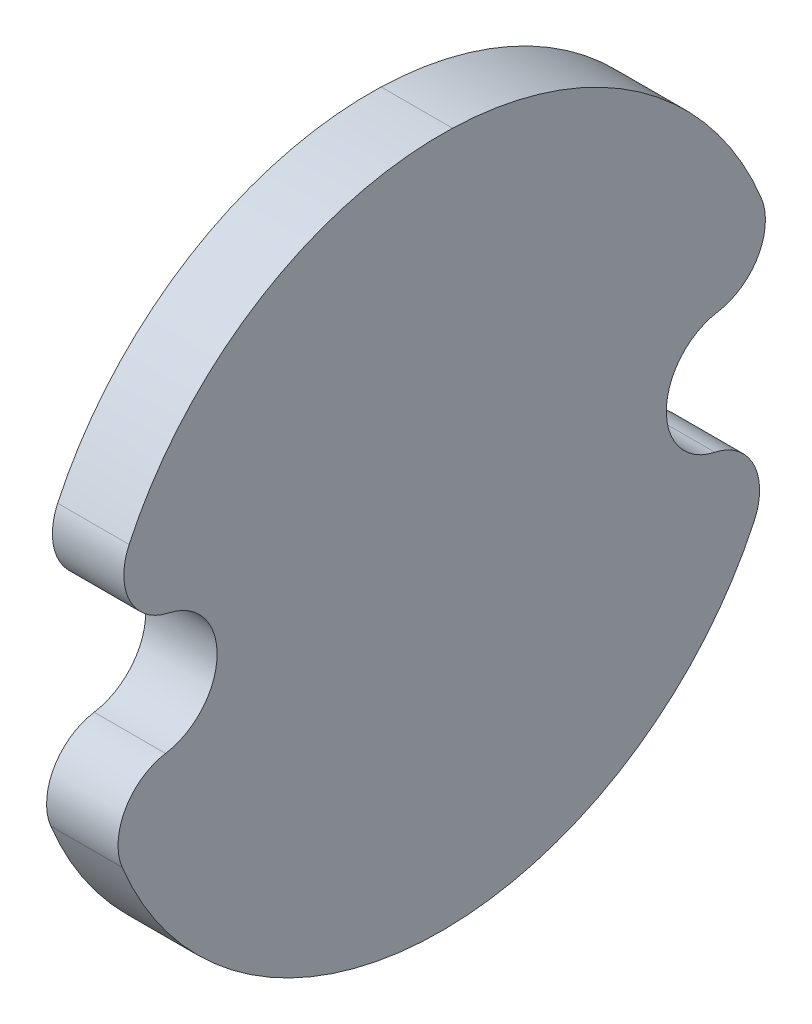
ISO-10303-21;
HEADER;
FILE_DESCRIPTION(('STEP AP214'),'2;1');
FILE_NAME('part.step','',(''),(''),'','','');
FILE_SCHEMA(('AUTOMOTIVE_DESIGN { 1 0 10303 214 1 1 1 1 }'));
ENDSEC;
DATA;
#1=APPLICATION_CONTEXT('core data for automotive mechanical design processes');
#2=APPLICATION_PROTOCOL_DEFINITION('international standard','automotive_design',2000,#1);
#3=PRODUCT_CONTEXT('',#1,'mechanical');
#4=PRODUCT('Part','Part','',(#3));
#5=PRODUCT_RELATED_PRODUCT_CATEGORY('part','',(#4));
#6=PRODUCT_DEFINITION_FORMATION('','',#4);
#7=PRODUCT_DEFINITION_CONTEXT('part definition',#1,'design');
#8=PRODUCT_DEFINITION('design','',#6,#7);
#9=PRODUCT_DEFINITION_SHAPE('','',#8);
#10=(LENGTH_UNIT() NAMED_UNIT(*) SI_UNIT(.MILLI.,.METRE.));
#11=(NAMED_UNIT(*) PLANE_ANGLE_UNIT() SI_UNIT($,.RADIAN.));
#12=(NAMED_UNIT(*) SI_UNIT($,.STERADIAN.) SOLID_ANGLE_UNIT());
#13=UNCERTAINTY_MEASURE_WITH_UNIT(LENGTH_MEASURE(1.E-05),#10,'distance_accuracy_value','');
#14=(GEOMETRIC_REPRESENTATION_CONTEXT(3) GLOBAL_UNCERTAINTY_ASSIGNED_CONTEXT((#13)) GLOBAL_UNIT_ASSIGNED_CONTEXT((#10,
#11,#12)) REPRESENTATION_CONTEXT('',''));
#15=CARTESIAN_POINT('',(0.,0.,0.));
#16=DIRECTION('',(0.,0.,1.));
#17=DIRECTION('',(1.,0.,0.));
#18=AXIS2_PLACEMENT_3D('',#15,#16,#17);
#19=CARTESIAN_POINT('',(-8.8260577609674,14.645610965575,4.562544302552));
#20=DIRECTION('',(1.,0.,0.));
#21=DIRECTION('',(0.,0.999511118958298,-0.031265365482126));
#22=AXIS2_PLACEMENT_3D('',#19,#20,#21);
#23=CYLINDRICAL_SURFACE('',#22,18.35);
#24=CARTESIAN_POINT('',(-8.8260577609674,14.645610965575,4.562544302552));
#25=DIRECTION('',(1.,0.,0.));
#26=DIRECTION('',(0.,0.999511118958298,-0.031265365482126));
#27=AXIS2_PLACEMENT_3D('',#24,#25,#26);
#28=CIRCLE('',#27,18.35);
#29=CARTESIAN_POINT('',(-8.8260577609674,21.5696866041654,-12.4309743604877));
#30=VERTEX_POINT('',#29);
#31=CARTESIAN_POINT('',(-8.8260577609674,32.9866399984598,3.98882484595499));
#32=VERTEX_POINT('',#31);
#33=EDGE_CURVE('E10',#30,#32,#28,.T.);
#34=ORIENTED_EDGE('',*,*,#33,.T.);
#35=DIRECTION('',(1.,0.,0.));
#36=VECTOR('',#35,1.);
#37=CARTESIAN_POINT('',(-8.8260577609674,32.9866399984598,3.98882484595499));
#38=LINE('',#37,#36);
#39=CARTESIAN_POINT('',(-5.0260577609674,32.9866399984598,3.98882484595499));
#40=VERTEX_POINT('',#39);
#41=EDGE_CURVE('E26',#32,#40,#38,.T.);
#42=ORIENTED_EDGE('',*,*,#41,.T.);
#43=CARTESIAN_POINT('',(-5.0260577609674,14.645610965575,4.562544302552));
#44=DIRECTION('',(1.,0.,0.));
#45=DIRECTION('',(0.,0.999511118958298,-0.031265365482126));
#46=AXIS2_PLACEMENT_3D('',#43,#44,#45);
#47=CIRCLE('',#46,18.35);
#48=CARTESIAN_POINT('',(-5.0260577609674,21.5696866041654,-12.4309743604877));
#49=VERTEX_POINT('',#48);
#50=EDGE_CURVE('E52',#49,#40,#47,.T.);
#51=ORIENTED_EDGE('',*,*,#50,.F.);
#52=DIRECTION('',(-1.,0.,0.));
#53=VECTOR('',#52,1.);
#54=CARTESIAN_POINT('',(-8.8260577609674,21.5696866041654,-12.4309743604877));
#55=LINE('',#54,#53);
#56=EDGE_CURVE('E235',#49,#30,#55,.T.);
#57=ORIENTED_EDGE('',*,*,#56,.T.);
#58=EDGE_LOOP('',(#34,#42,#51,#57));
#59=FACE_BOUND('',#58,.T.);
#60=ADVANCED_FACE('F16',(#59),#23,.T.);
#61=CARTESIAN_POINT('',(-5.0260577609674,14.645610965575,4.562544302552));
#62=DIRECTION('',(1.,0.,0.));
#63=DIRECTION('',(0.,0.999511118958298,-0.031265365482126));
#64=AXIS2_PLACEMENT_3D('',#61,#62,#63);
#65=PLANE('',#64);
#66=ORIENTED_EDGE('',*,*,#50,.T.);
#67=CARTESIAN_POINT('',(-5.0260577609674,14.645610965575,4.562544302552));
#68=DIRECTION('',(1.,0.,0.));
#69=DIRECTION('',(0.,0.999511118958298,-0.031265365482126));
#70=AXIS2_PLACEMENT_3D('',#67,#68,#69);
#71=CIRCLE('',#70,18.35);
#72=CARTESIAN_POINT('',(-5.0260577609674,22.4118076128462,21.1880875909957));
#73=VERTEX_POINT('',#72);
#74=EDGE_CURVE('E241',#40,#73,#71,.T.);
#75=ORIENTED_EDGE('',*,*,#74,.T.);
#76=CARTESIAN_POINT('',(-5.0260577609674,21.1421296868618,18.4700151187706));
#77=DIRECTION('',(1.,0.,0.));
#78=DIRECTION('',(0.,0.999511118958298,-0.031265365482126));
#79=AXIS2_PLACEMENT_3D('',#76,#77,#78);
#80=CIRCLE('',#79,3.);
#81=CARTESIAN_POINT('',(-5.0260577609674,18.2065002726354,19.088141272827));
#82=VERTEX_POINT('',#81);
#83=EDGE_CURVE('E248',#73,#82,#80,.T.);
#84=ORIENTED_EDGE('',*,*,#83,.T.);
#85=CARTESIAN_POINT('',(-5.0260577609674,15.0262350738901,19.7577779397216));
#86=DIRECTION('',(-1.,0.,0.));
#87=DIRECTION('',(0.,0.999511118958298,-0.031265365482126));
#88=AXIS2_PLACEMENT_3D('',#85,#86,#87);
#89=CIRCLE('',#88,3.25);
#90=CARTESIAN_POINT('',(-5.0260577609674,11.816431968235,19.2482055474878));
#91=VERTEX_POINT('',#90);
#92=EDGE_CURVE('E282',#82,#91,#89,.T.);
#93=ORIENTED_EDGE('',*,*,#92,.T.);
#94=CARTESIAN_POINT('',(-5.0260577609674,8.8535367937841,18.7778310315798));
#95=DIRECTION('',(1.,0.,0.));
#96=DIRECTION('',(0.,0.999511118958298,-0.031265365482126));
#97=AXIS2_PLACEMENT_3D('',#94,#95,#96);
#98=CIRCLE('',#97,3.);
#99=CARTESIAN_POINT('',(-5.0260577609674,7.72153532698459,21.5560629655917));
#100=VERTEX_POINT('',#99);
#101=EDGE_CURVE('E274',#91,#100,#98,.T.);
#102=ORIENTED_EDGE('',*,*,#101,.T.);
#103=CARTESIAN_POINT('',(-5.0260577609674,14.645610965575,4.562544302552));
#104=DIRECTION('',(1.,0.,0.));
#105=DIRECTION('',(0.,0.999511118958298,-0.031265365482126));
#106=AXIS2_PLACEMENT_3D('',#103,#104,#105);
#107=CIRCLE('',#106,18.35);
#108=CARTESIAN_POINT('',(-5.0260577609674,6.87941431830383,-12.0629989858917));
#109=VERTEX_POINT('',#108);
#110=EDGE_CURVE('E218',#100,#109,#107,.T.);
#111=ORIENTED_EDGE('',*,*,#110,.T.);
#112=CARTESIAN_POINT('',(-5.0260577609674,8.14909224428822,-9.34492651366656));
#113=DIRECTION('',(1.,0.,0.));
#114=DIRECTION('',(0.,0.999511118958298,-0.031265365482126));
#115=AXIS2_PLACEMENT_3D('',#112,#113,#114);
#116=CIRCLE('',#115,3.);
#117=CARTESIAN_POINT('',(-5.0260577609674,11.0847216585146,-9.96305266772303));
#118=VERTEX_POINT('',#117);
#119=EDGE_CURVE('E214',#109,#118,#116,.T.);
#120=ORIENTED_EDGE('',*,*,#119,.T.);
#121=CARTESIAN_POINT('',(-5.0260577609674,14.2649868572599,-10.6326893346176));
#122=DIRECTION('',(-1.,0.,0.));
#123=DIRECTION('',(0.,0.999511118958298,-0.031265365482126));
#124=AXIS2_PLACEMENT_3D('',#121,#122,#123);
#125=CIRCLE('',#124,3.25);
#126=CARTESIAN_POINT('',(-5.0260577609674,17.474789962915,-10.1231169423838));
#127=VERTEX_POINT('',#126);
#128=EDGE_CURVE('E219',#118,#127,#125,.T.);
#129=ORIENTED_EDGE('',*,*,#128,.T.);
#130=CARTESIAN_POINT('',(-5.0260577609674,20.4376851373659,-9.65274242647581));
#131=DIRECTION('',(1.,0.,0.));
#132=DIRECTION('',(0.,0.999511118958298,-0.031265365482126));
#133=AXIS2_PLACEMENT_3D('',#130,#131,#132);
#134=CIRCLE('',#133,3.);
#135=EDGE_CURVE('E236',#127,#49,#134,.T.);
#136=ORIENTED_EDGE('',*,*,#135,.T.);
#137=EDGE_LOOP('',(#66,#75,#84,#93,#102,#111,#120,#129,#136));
#138=FACE_BOUND('',#137,.T.);
#139=ADVANCED_FACE('F18',(#138),#65,.T.);
#140=CARTESIAN_POINT('',(-8.8260577609674,14.645610965575,4.562544302552));
#141=DIRECTION('',(1.,0.,0.));
#142=DIRECTION('',(0.,0.999511118958298,-0.031265365482126));
#143=AXIS2_PLACEMENT_3D('',#140,#141,#142);
#144=CYLINDRICAL_SURFACE('',#143,18.35);
#145=ORIENTED_EDGE('',*,*,#41,.F.);
#146=CARTESIAN_POINT('',(-8.8260577609674,14.645610965575,4.562544302552));
#147=DIRECTION('',(1.,0.,0.));
#148=DIRECTION('',(0.,0.999511118958298,-0.031265365482126));
#149=AXIS2_PLACEMENT_3D('',#146,#147,#148);
#150=CIRCLE('',#149,18.35);
#151=CARTESIAN_POINT('',(-8.8260577609674,22.4118076128462,21.1880875909957));
#152=VERTEX_POINT('',#151);
#153=EDGE_CURVE('E224',#32,#152,#150,.T.);
#154=ORIENTED_EDGE('',*,*,#153,.T.);
#155=DIRECTION('',(1.,0.,0.));
#156=VECTOR('',#155,1.);
#157=CARTESIAN_POINT('',(-8.8260577609674,22.4118076128462,21.1880875909957));
#158=LINE('',#157,#156);
#159=EDGE_CURVE('E220',#152,#73,#158,.T.);
#160=ORIENTED_EDGE('',*,*,#159,.T.);
#161=ORIENTED_EDGE('',*,*,#74,.F.);
#162=EDGE_LOOP('',(#145,#154,#160,#161));
#163=FACE_BOUND('',#162,.T.);
#164=ADVANCED_FACE('F337',(#163),#144,.T.);
#165=CARTESIAN_POINT('',(-8.8260577609674,20.4376851373659,-9.65274242647581));
#166=DIRECTION('',(1.,0.,0.));
#167=DIRECTION('',(0.,0.999511118958298,-0.031265365482126));
#168=AXIS2_PLACEMENT_3D('',#165,#166,#167);
#169=CYLINDRICAL_SURFACE('',#168,3.);
#170=CARTESIAN_POINT('',(-8.8260577609674,20.4376851373659,-9.65274242647581));
#171=DIRECTION('',(1.,0.,0.));
#172=DIRECTION('',(0.,0.999511118958298,-0.031265365482126));
#173=AXIS2_PLACEMENT_3D('',#170,#171,#172);
#174=CIRCLE('',#173,3.);
#175=CARTESIAN_POINT('',(-8.8260577609674,17.474789962915,-10.1231169423838));
#176=VERTEX_POINT('',#175);
#177=EDGE_CURVE('E225',#176,#30,#174,.T.);
#178=ORIENTED_EDGE('',*,*,#177,.T.);
#179=ORIENTED_EDGE('',*,*,#56,.F.);
#180=ORIENTED_EDGE('',*,*,#135,.F.);
#181=DIRECTION('',(-1.,0.,0.));
#182=VECTOR('',#181,1.);
#183=CARTESIAN_POINT('',(-8.8260577609674,17.474789962915,-10.1231169423838));
#184=LINE('',#183,#182);
#185=EDGE_CURVE('E251',#127,#176,#184,.T.);
#186=ORIENTED_EDGE('',*,*,#185,.T.);
#187=EDGE_LOOP('',(#178,#179,#180,#186));
#188=FACE_BOUND('',#187,.T.);
#189=ADVANCED_FACE('F344',(#188),#169,.T.);
#190=CARTESIAN_POINT('',(-8.8260577609674,14.2649868572599,-10.6326893346176));
#191=DIRECTION('',(1.,0.,0.));
#192=DIRECTION('',(0.,0.999511118958298,-0.031265365482126));
#193=AXIS2_PLACEMENT_3D('',#190,#191,#192);
#194=CYLINDRICAL_SURFACE('',#193,3.25);
#195=ORIENTED_EDGE('',*,*,#128,.F.);
#196=DIRECTION('',(1.,0.,0.));
#197=VECTOR('',#196,1.);
#198=CARTESIAN_POINT('',(-8.8260577609674,11.0847216585146,-9.96305266772303));
#199=LINE('',#198,#197);
#200=CARTESIAN_POINT('',(-8.8260577609674,11.0847216585146,-9.96305266772303));
#201=VERTEX_POINT('',#200);
#202=EDGE_CURVE('E276',#201,#118,#199,.T.);
#203=ORIENTED_EDGE('',*,*,#202,.F.);
#204=CARTESIAN_POINT('',(-8.8260577609674,14.2649868572599,-10.6326893346176));
#205=DIRECTION('',(1.,0.,0.));
#206=DIRECTION('',(0.,0.999511118958298,-0.031265365482126));
#207=AXIS2_PLACEMENT_3D('',#204,#205,#206);
#208=CIRCLE('',#207,3.25);
#209=EDGE_CURVE('E74',#176,#201,#208,.T.);
#210=ORIENTED_EDGE('',*,*,#209,.F.);
#211=ORIENTED_EDGE('',*,*,#185,.F.);
#212=EDGE_LOOP('',(#195,#203,#210,#211));
#213=FACE_BOUND('',#212,.T.);
#214=ADVANCED_FACE('F366',(#213),#194,.F.);
#215=CARTESIAN_POINT('',(-8.8260577609674,8.14909224428822,-9.34492651366656));
#216=DIRECTION('',(1.,0.,0.));
#217=DIRECTION('',(0.,0.999511118958298,-0.031265365482126));
#218=AXIS2_PLACEMENT_3D('',#215,#216,#217);
#219=CYLINDRICAL_SURFACE('',#218,3.);
#220=CARTESIAN_POINT('',(-8.8260577609674,8.14909224428822,-9.34492651366656));
#221=DIRECTION('',(1.,0.,0.));
#222=DIRECTION('',(0.,0.999511118958298,-0.031265365482126));
#223=AXIS2_PLACEMENT_3D('',#220,#221,#222);
#224=CIRCLE('',#223,3.);
#225=CARTESIAN_POINT('',(-8.8260577609674,6.87941431830383,-12.0629989858917));
#226=VERTEX_POINT('',#225);
#227=EDGE_CURVE('E279',#226,#201,#224,.T.);
#228=ORIENTED_EDGE('',*,*,#227,.T.);
#229=ORIENTED_EDGE('',*,*,#202,.T.);
#230=ORIENTED_EDGE('',*,*,#119,.F.);
#231=DIRECTION('',(-1.,0.,0.));
#232=VECTOR('',#231,1.);
#233=CARTESIAN_POINT('',(-8.8260577609674,6.87941431830382,-12.0629989858917));
#234=LINE('',#233,#232);
#235=EDGE_CURVE('E92',#109,#226,#234,.T.);
#236=ORIENTED_EDGE('',*,*,#235,.T.);
#237=EDGE_LOOP('',(#228,#229,#230,#236));
#238=FACE_BOUND('',#237,.T.);
#239=ADVANCED_FACE('F363',(#238),#219,.T.);
#240=CARTESIAN_POINT('',(-8.8260577609674,14.645610965575,4.562544302552));
#241=DIRECTION('',(1.,0.,0.));
#242=DIRECTION('',(0.,0.999511118958298,-0.031265365482126));
#243=AXIS2_PLACEMENT_3D('',#240,#241,#242);
#244=CYLINDRICAL_SURFACE('',#243,18.35);
#245=ORIENTED_EDGE('',*,*,#235,.F.);
#246=ORIENTED_EDGE('',*,*,#110,.F.);
#247=DIRECTION('',(-1.,0.,0.));
#248=VECTOR('',#247,1.);
#249=CARTESIAN_POINT('',(-8.8260577609674,7.72153532698459,21.5560629655917));
#250=LINE('',#249,#248);
#251=CARTESIAN_POINT('',(-8.8260577609674,7.72153532698458,21.5560629655917));
#252=VERTEX_POINT('',#251);
#253=EDGE_CURVE('E228',#100,#252,#250,.T.);
#254=ORIENTED_EDGE('',*,*,#253,.T.);
#255=CARTESIAN_POINT('',(-8.8260577609674,14.645610965575,4.562544302552));
#256=DIRECTION('',(1.,0.,0.));
#257=DIRECTION('',(0.,0.999511118958298,-0.031265365482126));
#258=AXIS2_PLACEMENT_3D('',#255,#256,#257);
#259=CIRCLE('',#258,18.35);
#260=EDGE_CURVE('E232',#252,#226,#259,.T.);
#261=ORIENTED_EDGE('',*,*,#260,.T.);
#262=EDGE_LOOP('',(#245,#246,#254,#261));
#263=FACE_BOUND('',#262,.T.);
#264=ADVANCED_FACE('F360',(#263),#244,.T.);
#265=CARTESIAN_POINT('',(-8.8260577609674,8.8535367937841,18.7778310315798));
#266=DIRECTION('',(1.,0.,0.));
#267=DIRECTION('',(0.,0.999511118958298,-0.031265365482126));
#268=AXIS2_PLACEMENT_3D('',#265,#266,#267);
#269=CYLINDRICAL_SURFACE('',#268,3.);
#270=CARTESIAN_POINT('',(-8.8260577609674,8.8535367937841,18.7778310315798));
#271=DIRECTION('',(1.,0.,0.));
#272=DIRECTION('',(0.,0.999511118958298,-0.031265365482126));
#273=AXIS2_PLACEMENT_3D('',#270,#271,#272);
#274=CIRCLE('',#273,3.);
#275=CARTESIAN_POINT('',(-8.8260577609674,11.816431968235,19.2482055474878));
#276=VERTEX_POINT('',#275);
#277=EDGE_CURVE('E245',#276,#252,#274,.T.);
#278=ORIENTED_EDGE('',*,*,#277,.T.);
#279=ORIENTED_EDGE('',*,*,#253,.F.);
#280=ORIENTED_EDGE('',*,*,#101,.F.);
#281=DIRECTION('',(-1.,0.,0.));
#282=VECTOR('',#281,1.);
#283=CARTESIAN_POINT('',(-8.8260577609674,11.816431968235,19.2482055474878));
#284=LINE('',#283,#282);
#285=EDGE_CURVE('E271',#91,#276,#284,.T.);
#286=ORIENTED_EDGE('',*,*,#285,.T.);
#287=EDGE_LOOP('',(#278,#279,#280,#286));
#288=FACE_BOUND('',#287,.T.);
#289=ADVANCED_FACE('F331',(#288),#269,.T.);
#290=CARTESIAN_POINT('',(-8.8260577609674,15.0262350738901,19.7577779397216));
#291=DIRECTION('',(1.,0.,0.));
#292=DIRECTION('',(0.,0.999511118958298,-0.031265365482126));
#293=AXIS2_PLACEMENT_3D('',#290,#291,#292);
#294=CYLINDRICAL_SURFACE('',#293,3.25);
#295=ORIENTED_EDGE('',*,*,#92,.F.);
#296=DIRECTION('',(1.,0.,0.));
#297=VECTOR('',#296,1.);
#298=CARTESIAN_POINT('',(-8.8260577609674,18.2065002726354,19.088141272827));
#299=LINE('',#298,#297);
#300=CARTESIAN_POINT('',(-8.8260577609674,18.2065002726354,19.088141272827));
#301=VERTEX_POINT('',#300);
#302=EDGE_CURVE('E302',#301,#82,#299,.T.);
#303=ORIENTED_EDGE('',*,*,#302,.F.);
#304=CARTESIAN_POINT('',(-8.8260577609674,15.0262350738901,19.7577779397216));
#305=DIRECTION('',(1.,0.,0.));
#306=DIRECTION('',(0.,0.999511118958298,-0.031265365482126));
#307=AXIS2_PLACEMENT_3D('',#304,#305,#306);
#308=CIRCLE('',#307,3.25);
#309=EDGE_CURVE('E213',#276,#301,#308,.T.);
#310=ORIENTED_EDGE('',*,*,#309,.F.);
#311=ORIENTED_EDGE('',*,*,#285,.F.);
#312=EDGE_LOOP('',(#295,#303,#310,#311));
#313=FACE_BOUND('',#312,.T.);
#314=ADVANCED_FACE('F333',(#313),#294,.F.);
#315=CARTESIAN_POINT('',(-8.8260577609674,21.1421296868618,18.4700151187706));
#316=DIRECTION('',(1.,0.,0.));
#317=DIRECTION('',(0.,0.999511118958298,-0.031265365482126));
#318=AXIS2_PLACEMENT_3D('',#315,#316,#317);
#319=CYLINDRICAL_SURFACE('',#318,3.);
#320=CARTESIAN_POINT('',(-8.8260577609674,21.1421296868618,18.4700151187706));
#321=DIRECTION('',(1.,0.,0.));
#322=DIRECTION('',(0.,0.999511118958298,-0.031265365482126));
#323=AXIS2_PLACEMENT_3D('',#320,#321,#322);
#324=CIRCLE('',#323,3.);
#325=EDGE_CURVE('E204',#152,#301,#324,.T.);
#326=ORIENTED_EDGE('',*,*,#325,.T.);
#327=ORIENTED_EDGE('',*,*,#302,.T.);
#328=ORIENTED_EDGE('',*,*,#83,.F.);
#329=ORIENTED_EDGE('',*,*,#159,.F.);
#330=EDGE_LOOP('',(#326,#327,#328,#329));
#331=FACE_BOUND('',#330,.T.);
#332=ADVANCED_FACE('F334',(#331),#319,.T.);
#333=CARTESIAN_POINT('',(-8.8260577609674,14.645610965575,4.562544302552));
#334=DIRECTION('',(1.,0.,0.));
#335=DIRECTION('',(0.,0.999511118958298,-0.031265365482126));
#336=AXIS2_PLACEMENT_3D('',#333,#334,#335);
#337=PLANE('',#336);
#338=ORIENTED_EDGE('',*,*,#260,.F.);
#339=ORIENTED_EDGE('',*,*,#277,.F.);
#340=ORIENTED_EDGE('',*,*,#309,.T.);
#341=ORIENTED_EDGE('',*,*,#325,.F.);
#342=ORIENTED_EDGE('',*,*,#153,.F.);
#343=ORIENTED_EDGE('',*,*,#33,.F.);
#344=ORIENTED_EDGE('',*,*,#177,.F.);
#345=ORIENTED_EDGE('',*,*,#209,.T.);
#346=ORIENTED_EDGE('',*,*,#227,.F.);
#347=EDGE_LOOP('',(#338,#339,#340,#341,#342,#343,#344,#345,#346));
#348=FACE_BOUND('',#347,.T.);
#349=DIRECTION('',(0.,0.0250410597575709,0.999686423497998));
#350=VECTOR('',#349,1.);
#351=CARTESIAN_POINT('',(-8.8260577609674,11.9584023903925,2.72814943875275));
#352=LINE('',#351,#350);
#353=CARTESIAN_POINT('',(-8.8260577609674,11.9584023903925,2.72814943875274));
#354=VERTEX_POINT('',#353);
#355=CARTESIAN_POINT('',(-8.8260577609674,12.0536140181989,6.52917753415895));
#356=VERTEX_POINT('',#355);
#357=EDGE_CURVE('E127',#354,#356,#352,.T.);
#358=ORIENTED_EDGE('',*,*,#357,.F.);
#359=DIRECTION('',(0.,-0.999686423497998,0.0250410597575713));
#360=VECTOR('',#359,1.);
#361=CARTESIAN_POINT('',(-8.8260577609674,17.2376079129511,2.59591107094505));
#362=LINE('',#361,#360);
#363=CARTESIAN_POINT('',(-8.8260577609674,17.2376079129511,2.59591107094505));
#364=VERTEX_POINT('',#363);
#365=EDGE_CURVE('E194',#364,#354,#362,.T.);
#366=ORIENTED_EDGE('',*,*,#365,.F.);
#367=DIRECTION('',(0.,-0.025041059757571,-0.999686423497998));
#368=VECTOR('',#367,1.);
#369=CARTESIAN_POINT('',(-8.8260577609674,17.3328195407575,6.39693916635125));
#370=LINE('',#369,#368);
#371=CARTESIAN_POINT('',(-8.8260577609674,17.3328195407575,6.39693916635125));
#372=VERTEX_POINT('',#371);
#373=EDGE_CURVE('E112',#372,#364,#370,.T.);
#374=ORIENTED_EDGE('',*,*,#373,.F.);
#375=DIRECTION('',(0.,0.999686423497998,-0.0250410597575714));
#376=VECTOR('',#375,1.);
#377=CARTESIAN_POINT('',(-8.8260577609674,12.0536140181989,6.52917753415895));
#378=LINE('',#377,#376);
#379=EDGE_CURVE('E20',#356,#372,#378,.T.);
#380=ORIENTED_EDGE('',*,*,#379,.F.);
#381=EDGE_LOOP('',(#358,#366,#374,#380));
#382=FACE_BOUND('',#381,.T.);
#383=ADVANCED_FACE('F259',(#348,#382),#337,.F.);
#384=CARTESIAN_POINT('',(-8.8260577609674,12.0536140181989,6.52917753415895));
#385=DIRECTION('',(0.,0.0250410597575711,0.999686423497998));
#386=DIRECTION('',(-1.,0.,0.));
#387=AXIS2_PLACEMENT_3D('',#384,#385,#386);
#388=PLANE('',#387);
#389=DIRECTION('',(0.,-0.999686423497998,0.0250410597575711));
#390=VECTOR('',#389,1.);
#391=CARTESIAN_POINT('',(-10.5260577609674,12.0536140181989,6.52917753415895));
#392=LINE('',#391,#390);
#393=CARTESIAN_POINT('',(-10.5260577609674,17.3328195407575,6.39693916635125));
#394=VERTEX_POINT('',#393);
#395=CARTESIAN_POINT('',(-10.5260577609674,12.0536140181989,6.52917753415895));
#396=VERTEX_POINT('',#395);
#397=EDGE_CURVE('E172',#394,#396,#392,.T.);
#398=ORIENTED_EDGE('',*,*,#397,.T.);
#399=DIRECTION('',(1.,0.,0.));
#400=VECTOR('',#399,1.);
#401=CARTESIAN_POINT('',(-8.8260577609674,12.0536140181989,6.52917753415895));
#402=LINE('',#401,#400);
#403=EDGE_CURVE('E186',#396,#356,#402,.T.);
#404=ORIENTED_EDGE('',*,*,#403,.T.);
#405=ORIENTED_EDGE('',*,*,#379,.T.);
#406=DIRECTION('',(-1.,0.,0.));
#407=VECTOR('',#406,1.);
#408=CARTESIAN_POINT('',(-8.8260577609674,17.3328195407575,6.39693916635126));
#409=LINE('',#408,#407);
#410=EDGE_CURVE('E168',#372,#394,#409,.T.);
#411=ORIENTED_EDGE('',*,*,#410,.T.);
#412=EDGE_LOOP('',(#398,#404,#405,#411));
#413=FACE_BOUND('',#412,.T.);
#414=ADVANCED_FACE('F170',(#413),#388,.T.);
#415=CARTESIAN_POINT('',(-8.8260577609674,11.9584023903925,2.72814943875275));
#416=DIRECTION('',(0.,-0.999686423497998,0.0250410597575711));
#417=DIRECTION('',(0.,-0.0250410597575711,-0.999686423497998));
#418=AXIS2_PLACEMENT_3D('',#415,#416,#417);
#419=PLANE('',#418);
#420=DIRECTION('',(0.,-0.0250410597575711,-0.999686423497998));
#421=VECTOR('',#420,1.);
#422=CARTESIAN_POINT('',(-10.5260577609674,11.9584023903925,2.72814943875275));
#423=LINE('',#422,#421);
#424=CARTESIAN_POINT('',(-10.5260577609674,11.9584023903925,2.72814943875275));
#425=VERTEX_POINT('',#424);
#426=EDGE_CURVE('E177',#396,#425,#423,.T.);
#427=ORIENTED_EDGE('',*,*,#426,.T.);
#428=DIRECTION('',(1.,0.,0.));
#429=VECTOR('',#428,1.);
#430=CARTESIAN_POINT('',(-8.8260577609674,11.9584023903925,2.72814943875275));
#431=LINE('',#430,#429);
#432=EDGE_CURVE('E209',#425,#354,#431,.T.);
#433=ORIENTED_EDGE('',*,*,#432,.T.);
#434=ORIENTED_EDGE('',*,*,#357,.T.);
#435=ORIENTED_EDGE('',*,*,#403,.F.);
#436=EDGE_LOOP('',(#427,#433,#434,#435));
#437=FACE_BOUND('',#436,.T.);
#438=ADVANCED_FACE('F256',(#437),#419,.T.);
#439=CARTESIAN_POINT('',(-8.8260577609674,17.2376079129511,2.59591107094505));
#440=DIRECTION('',(0.,-0.0250410597575711,-0.999686423497998));
#441=DIRECTION('',(-1.,0.,0.));
#442=AXIS2_PLACEMENT_3D('',#439,#440,#441);
#443=PLANE('',#442);
#444=DIRECTION('',(0.,0.999686423497998,-0.0250410597575711));
#445=VECTOR('',#444,1.);
#446=CARTESIAN_POINT('',(-10.5260577609674,17.2376079129511,2.59591107094505));
#447=LINE('',#446,#445);
#448=CARTESIAN_POINT('',(-10.5260577609674,17.2376079129511,2.59591107094505));
#449=VERTEX_POINT('',#448);
#450=EDGE_CURVE('E210',#425,#449,#447,.T.);
#451=ORIENTED_EDGE('',*,*,#450,.T.);
#452=DIRECTION('',(1.,0.,0.));
#453=VECTOR('',#452,1.);
#454=CARTESIAN_POINT('',(-8.8260577609674,17.2376079129511,2.59591107094505));
#455=LINE('',#454,#453);
#456=EDGE_CURVE('E191',#449,#364,#455,.T.);
#457=ORIENTED_EDGE('',*,*,#456,.T.);
#458=ORIENTED_EDGE('',*,*,#365,.T.);
#459=ORIENTED_EDGE('',*,*,#432,.F.);
#460=EDGE_LOOP('',(#451,#457,#458,#459));
#461=FACE_BOUND('',#460,.T.);
#462=ADVANCED_FACE('F258',(#461),#443,.T.);
#463=CARTESIAN_POINT('',(-8.8260577609674,17.3328195407575,6.39693916635125));
#464=DIRECTION('',(0.,0.999686423497998,-0.0250410597575711));
#465=DIRECTION('',(1.,0.,0.));
#466=AXIS2_PLACEMENT_3D('',#463,#464,#465);
#467=PLANE('',#466);
#468=DIRECTION('',(0.,0.0250410597575711,0.999686423497998));
#469=VECTOR('',#468,1.);
#470=CARTESIAN_POINT('',(-10.5260577609674,17.3328195407575,6.39693916635125));
#471=LINE('',#470,#469);
#472=EDGE_CURVE('E183',#449,#394,#471,.T.);
#473=ORIENTED_EDGE('',*,*,#472,.T.);
#474=ORIENTED_EDGE('',*,*,#410,.F.);
#475=ORIENTED_EDGE('',*,*,#373,.T.);
#476=ORIENTED_EDGE('',*,*,#456,.F.);
#477=EDGE_LOOP('',(#473,#474,#475,#476));
#478=FACE_BOUND('',#477,.T.);
#479=ADVANCED_FACE('F189',(#478),#467,.T.);
#480=CARTESIAN_POINT('',(-10.5260577609674,14.645610965575,4.562544302552));
#481=DIRECTION('',(-1.,0.,0.));
#482=DIRECTION('',(0.,0.999511118958298,-0.031265365482126));
#483=AXIS2_PLACEMENT_3D('',#480,#481,#482);
#484=PLANE('',#483);
#485=ORIENTED_EDGE('',*,*,#472,.F.);
#486=ORIENTED_EDGE('',*,*,#450,.F.);
#487=ORIENTED_EDGE('',*,*,#426,.F.);
#488=ORIENTED_EDGE('',*,*,#397,.F.);
#489=EDGE_LOOP('',(#485,#486,#487,#488));
#490=FACE_BOUND('',#489,.T.);
#491=ADVANCED_FACE('F181',(#490),#484,.T.);
#492=CLOSED_SHELL('',(#60,#139,#164,#189,#214,#239,#264,#289,#314,#332,#383,#414,#438,#462,#479,#491));
#493=MANIFOLD_SOLID_BREP('B1',#492);
#494=ADVANCED_BREP_SHAPE_REPRESENTATION('',(#18,#493),#14);
#495=SHAPE_DEFINITION_REPRESENTATION(#9,#494);
ENDSEC;
END-ISO-10303-21;
